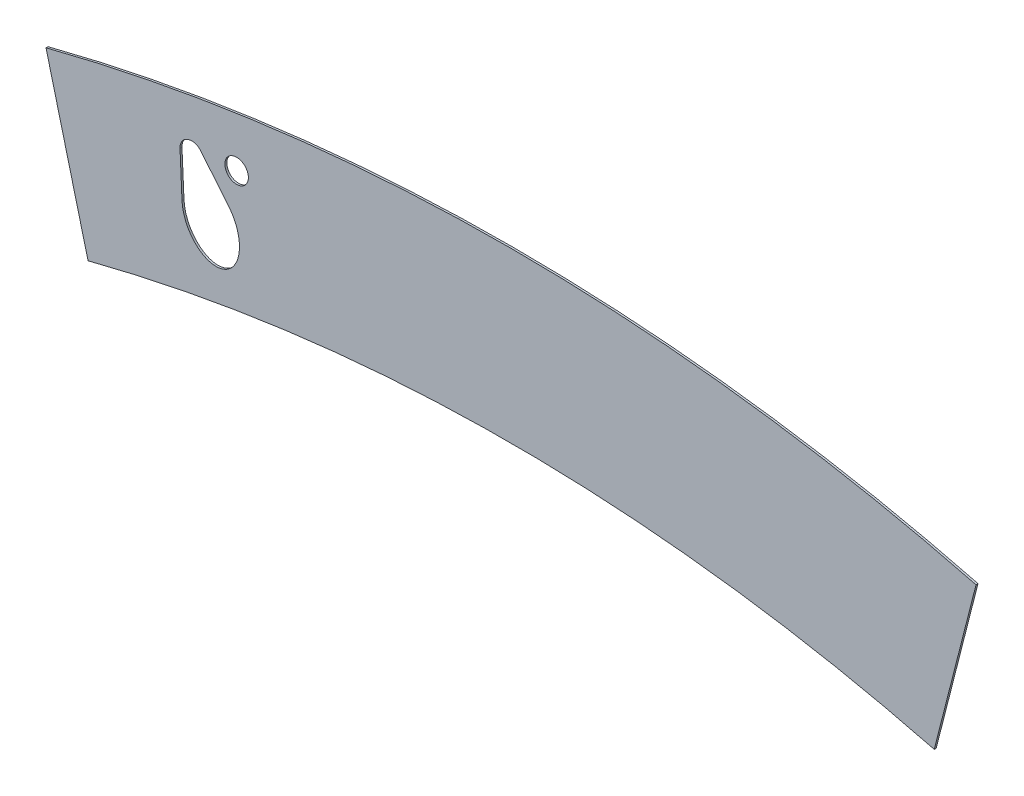
ISO-10303-21;
HEADER;
FILE_DESCRIPTION(('STEP AP214'),'2;1');
FILE_NAME('part.step','',(''),(''),'','','');
FILE_SCHEMA(('AUTOMOTIVE_DESIGN { 1 0 10303 214 1 1 1 1 }'));
ENDSEC;
DATA;
#1=APPLICATION_CONTEXT('core data for automotive mechanical design processes');
#2=APPLICATION_PROTOCOL_DEFINITION('international standard','automotive_design',2000,#1);
#3=PRODUCT_CONTEXT('',#1,'mechanical');
#4=PRODUCT('Part','Part','',(#3));
#5=PRODUCT_RELATED_PRODUCT_CATEGORY('part','',(#4));
#6=PRODUCT_DEFINITION_FORMATION('','',#4);
#7=PRODUCT_DEFINITION_CONTEXT('part definition',#1,'design');
#8=PRODUCT_DEFINITION('design','',#6,#7);
#9=PRODUCT_DEFINITION_SHAPE('','',#8);
#10=(LENGTH_UNIT() NAMED_UNIT(*) SI_UNIT(.MILLI.,.METRE.));
#11=(NAMED_UNIT(*) PLANE_ANGLE_UNIT() SI_UNIT($,.RADIAN.));
#12=(NAMED_UNIT(*) SI_UNIT($,.STERADIAN.) SOLID_ANGLE_UNIT());
#13=UNCERTAINTY_MEASURE_WITH_UNIT(LENGTH_MEASURE(1.E-05),#10,'distance_accuracy_value','');
#14=(GEOMETRIC_REPRESENTATION_CONTEXT(3) GLOBAL_UNCERTAINTY_ASSIGNED_CONTEXT((#13)) GLOBAL_UNIT_ASSIGNED_CONTEXT((#10,
#11,#12)) REPRESENTATION_CONTEXT('',''));
#15=CARTESIAN_POINT('',(0.,0.,0.));
#16=DIRECTION('',(0.,0.,1.));
#17=DIRECTION('',(1.,0.,0.));
#18=AXIS2_PLACEMENT_3D('',#15,#16,#17);
#19=CARTESIAN_POINT('',(-1.22124532708767E-12,-3019.5266,-3.175));
#20=DIRECTION('',(0.,0.,1.));
#21=DIRECTION('',(1.,0.,0.));
#22=AXIS2_PLACEMENT_3D('',#19,#20,#21);
#23=CYLINDRICAL_SURFACE('',#22,3019.5266);
#24=CARTESIAN_POINT('',(-9.43689570931383E-13,-3019.5266,0.));
#25=DIRECTION('',(0.,0.,1.));
#26=DIRECTION('',(1.,0.,0.));
#27=AXIS2_PLACEMENT_3D('',#24,#25,#26);
#28=CIRCLE('',#27,3019.5266);
#29=CARTESIAN_POINT('',(752.475,-95.2622031845274,0.));
#30=VERTEX_POINT('',#29);
#31=CARTESIAN_POINT('',(-752.475000000001,-95.2622031845269,0.));
#32=VERTEX_POINT('',#31);
#33=EDGE_CURVE('E170',#30,#32,#28,.T.);
#34=ORIENTED_EDGE('',*,*,#33,.F.);
#35=DIRECTION('',(0.,0.,1.));
#36=VECTOR('',#35,1.);
#37=CARTESIAN_POINT('',(752.475,-95.2622031845269,-3.175));
#38=LINE('',#37,#36);
#39=CARTESIAN_POINT('',(752.475,-95.2622031845269,-3.175));
#40=VERTEX_POINT('',#39);
#41=EDGE_CURVE('E11',#40,#30,#38,.T.);
#42=ORIENTED_EDGE('',*,*,#41,.F.);
#43=CARTESIAN_POINT('',(-1.22124532708767E-12,-3019.5266,-3.175));
#44=DIRECTION('',(0.,0.,1.));
#45=DIRECTION('',(1.,0.,0.));
#46=AXIS2_PLACEMENT_3D('',#43,#44,#45);
#47=CIRCLE('',#46,3019.5266);
#48=CARTESIAN_POINT('',(-752.475000000002,-95.2622031845296,-3.175));
#49=VERTEX_POINT('',#48);
#50=EDGE_CURVE('E184',#40,#49,#47,.T.);
#51=ORIENTED_EDGE('',*,*,#50,.T.);
#52=DIRECTION('',(0.,0.,1.));
#53=VECTOR('',#52,1.);
#54=CARTESIAN_POINT('',(-752.475000000002,-95.2622031845296,-3.175));
#55=LINE('',#54,#53);
#56=EDGE_CURVE('E37',#49,#32,#55,.T.);
#57=ORIENTED_EDGE('',*,*,#56,.T.);
#58=EDGE_LOOP('',(#34,#42,#51,#57));
#59=FACE_BOUND('',#58,.T.);
#60=ADVANCED_FACE('F34',(#59),#23,.T.);
#61=CARTESIAN_POINT('',(752.475,-95.2622031845269,-3.175));
#62=DIRECTION('',(0.968807712269234,-0.247813673245961,0.));
#63=DIRECTION('',(0.247813673245961,0.968807712269234,0.));
#64=AXIS2_PLACEMENT_3D('',#61,#62,#63);
#65=PLANE('',#64);
#66=DIRECTION('',(0.247813673245961,0.968807712269234,0.));
#67=VECTOR('',#66,1.);
#68=CARTESIAN_POINT('',(752.475,-95.2622031845274,0.));
#69=LINE('',#68,#67);
#70=CARTESIAN_POINT('',(684.8094,-359.795448169199,0.));
#71=VERTEX_POINT('',#70);
#72=EDGE_CURVE('E181',#71,#30,#69,.T.);
#73=ORIENTED_EDGE('',*,*,#72,.F.);
#74=DIRECTION('',(0.,0.,1.));
#75=VECTOR('',#74,1.);
#76=CARTESIAN_POINT('',(684.8094,-359.795448169201,-3.175));
#77=LINE('',#76,#75);
#78=CARTESIAN_POINT('',(684.8094,-359.795448169201,-3.175));
#79=VERTEX_POINT('',#78);
#80=EDGE_CURVE('E42',#79,#71,#77,.T.);
#81=ORIENTED_EDGE('',*,*,#80,.F.);
#82=DIRECTION('',(0.247813673245961,0.968807712269234,0.));
#83=VECTOR('',#82,1.);
#84=CARTESIAN_POINT('',(752.475,-95.2622031845269,-3.175));
#85=LINE('',#84,#83);
#86=EDGE_CURVE('E196',#79,#40,#85,.T.);
#87=ORIENTED_EDGE('',*,*,#86,.T.);
#88=ORIENTED_EDGE('',*,*,#41,.T.);
#89=EDGE_LOOP('',(#73,#81,#87,#88));
#90=FACE_BOUND('',#89,.T.);
#91=ADVANCED_FACE('F152',(#90),#65,.T.);
#92=CARTESIAN_POINT('',(-1.22124532708767E-12,-3019.5266,-3.175));
#93=DIRECTION('',(0.,0.,1.));
#94=DIRECTION('',(1.,0.,0.));
#95=AXIS2_PLACEMENT_3D('',#92,#93,#94);
#96=CYLINDRICAL_SURFACE('',#95,2746.4766);
#97=CARTESIAN_POINT('',(-9.43689570931383E-13,-3019.5266,0.));
#98=DIRECTION('',(0.,0.,-1.));
#99=DIRECTION('',(1.,0.,0.));
#100=AXIS2_PLACEMENT_3D('',#97,#98,#99);
#101=CIRCLE('',#100,2746.4766);
#102=CARTESIAN_POINT('',(-684.4284,-359.697379989626,0.));
#103=VERTEX_POINT('',#102);
#104=EDGE_CURVE('E183',#103,#71,#101,.T.);
#105=ORIENTED_EDGE('',*,*,#104,.F.);
#106=DIRECTION('',(0.,0.,1.));
#107=VECTOR('',#106,1.);
#108=CARTESIAN_POINT('',(-684.428400000001,-359.697379989625,-3.175));
#109=LINE('',#108,#107);
#110=CARTESIAN_POINT('',(-684.428400000001,-359.697379989625,-3.175));
#111=VERTEX_POINT('',#110);
#112=EDGE_CURVE('E199',#111,#103,#109,.T.);
#113=ORIENTED_EDGE('',*,*,#112,.F.);
#114=CARTESIAN_POINT('',(-1.22124532708767E-12,-3019.5266,-3.175));
#115=DIRECTION('',(0.,0.,-1.));
#116=DIRECTION('',(1.,0.,0.));
#117=AXIS2_PLACEMENT_3D('',#114,#115,#116);
#118=CIRCLE('',#117,2746.4766);
#119=EDGE_CURVE('E193',#111,#79,#118,.T.);
#120=ORIENTED_EDGE('',*,*,#119,.T.);
#121=ORIENTED_EDGE('',*,*,#80,.T.);
#122=EDGE_LOOP('',(#105,#113,#120,#121));
#123=FACE_BOUND('',#122,.T.);
#124=ADVANCED_FACE('F155',(#123),#96,.F.);
#125=CARTESIAN_POINT('',(-752.475000000002,-95.2622031845296,-3.175));
#126=DIRECTION('',(-0.968449649510659,-0.249209302319726,0.));
#127=DIRECTION('',(0.249209302319726,-0.968449649510659,0.));
#128=AXIS2_PLACEMENT_3D('',#125,#126,#127);
#129=PLANE('',#128);
#130=DIRECTION('',(0.249209302319726,-0.968449649510658,0.));
#131=VECTOR('',#130,1.);
#132=CARTESIAN_POINT('',(-752.475000000001,-95.2622031845269,0.));
#133=LINE('',#132,#131);
#134=EDGE_CURVE('E176',#32,#103,#133,.T.);
#135=ORIENTED_EDGE('',*,*,#134,.F.);
#136=ORIENTED_EDGE('',*,*,#56,.F.);
#137=DIRECTION('',(0.249209302319726,-0.968449649510658,0.));
#138=VECTOR('',#137,1.);
#139=CARTESIAN_POINT('',(-752.475000000002,-95.2622031845296,-3.175));
#140=LINE('',#139,#138);
#141=EDGE_CURVE('E186',#49,#111,#140,.T.);
#142=ORIENTED_EDGE('',*,*,#141,.T.);
#143=ORIENTED_EDGE('',*,*,#112,.T.);
#144=EDGE_LOOP('',(#135,#136,#142,#143));
#145=FACE_BOUND('',#144,.T.);
#146=ADVANCED_FACE('F150',(#145),#129,.T.);
#147=CARTESIAN_POINT('',(-1.22124532708767E-12,-3019.5266,-3.175));
#148=DIRECTION('',(0.,0.,1.));
#149=DIRECTION('',(1.,0.,0.));
#150=AXIS2_PLACEMENT_3D('',#147,#148,#149);
#151=PLANE('',#150);
#152=DIRECTION('',(-0.633664459437603,0.773608009812239,0.));
#153=VECTOR('',#152,1.);
#154=CARTESIAN_POINT('',(-501.846758134813,-114.814876018588,-3.175));
#155=LINE('',#154,#153);
#156=CARTESIAN_POINT('',(-456.359855013674,-170.347472287755,-3.175));
#157=VERTEX_POINT('',#156);
#158=CARTESIAN_POINT('',(-501.846758134813,-114.814876018588,-3.175));
#159=VERTEX_POINT('',#158);
#160=EDGE_CURVE('E129',#157,#159,#155,.T.);
#161=ORIENTED_EDGE('',*,*,#160,.T.);
#162=CARTESIAN_POINT('',(-516.583990721737,-126.886183970876,-3.175));
#163=DIRECTION('',(0.,0.,1.));
#164=DIRECTION('',(1.,0.,0.));
#165=AXIS2_PLACEMENT_3D('',#162,#163,#164);
#166=CIRCLE('',#165,19.0500000000005);
#167=CARTESIAN_POINT('',(-535.614695533332,-127.743373782972,-3.175));
#168=VERTEX_POINT('',#167);
#169=EDGE_CURVE('E119',#159,#168,#166,.T.);
#170=ORIENTED_EDGE('',*,*,#169,.T.);
#171=DIRECTION('',(0.0449968405300511,-0.998987129217546,0.));
#172=VECTOR('',#171,1.);
#173=CARTESIAN_POINT('',(-535.614695533332,-127.743373782972,-3.175));
#174=LINE('',#173,#172);
#175=CARTESIAN_POINT('',(-532.384647050315,-199.454561130161,-3.175));
#176=VERTEX_POINT('',#175);
#177=EDGE_CURVE('E125',#168,#176,#174,.T.);
#178=ORIENTED_EDGE('',*,*,#177,.T.);
#179=CARTESIAN_POINT('',(-485.932750317386,-206.944144766006,-3.175));
#180=DIRECTION('',(0.,0.,1.));
#181=DIRECTION('',(-0.357553110578587,0.933892806009115,0.));
#182=AXIS2_PLACEMENT_3D('',#179,#180,#181);
#183=ELLIPSE('',#182,58.7375,44.4499999999999);
#184=EDGE_CURVE('E50',#176,#157,#183,.T.);
#185=ORIENTED_EDGE('',*,*,#184,.T.);
#186=EDGE_LOOP('',(#161,#170,#178,#185));
#187=FACE_BOUND('',#186,.T.);
#188=CARTESIAN_POINT('',(-444.017400000001,-113.461800000002,-3.175));
#189=DIRECTION('',(0.,0.,1.));
#190=DIRECTION('',(1.,0.,0.));
#191=AXIS2_PLACEMENT_3D('',#188,#189,#190);
#192=CIRCLE('',#191,19.05);
#193=CARTESIAN_POINT('',(-424.967400000001,-113.461800000002,-3.175));
#194=VERTEX_POINT('',#193);
#195=EDGE_CURVE('E177',#194,#194,#192,.T.);
#196=ORIENTED_EDGE('',*,*,#195,.T.);
#197=EDGE_LOOP('',(#196));
#198=FACE_BOUND('',#197,.T.);
#199=ORIENTED_EDGE('',*,*,#50,.F.);
#200=ORIENTED_EDGE('',*,*,#86,.F.);
#201=ORIENTED_EDGE('',*,*,#119,.F.);
#202=ORIENTED_EDGE('',*,*,#141,.F.);
#203=EDGE_LOOP('',(#199,#200,#201,#202));
#204=FACE_BOUND('',#203,.T.);
#205=ADVANCED_FACE('F147',(#187,#198,#204),#151,.F.);
#206=CARTESIAN_POINT('',(-9.43689570931383E-13,-3019.5266,0.));
#207=DIRECTION('',(0.,0.,1.));
#208=DIRECTION('',(1.,0.,0.));
#209=AXIS2_PLACEMENT_3D('',#206,#207,#208);
#210=PLANE('',#209);
#211=CARTESIAN_POINT('',(-516.583990721736,-126.886183970874,0.));
#212=DIRECTION('',(0.,0.,1.));
#213=DIRECTION('',(1.,0.,0.));
#214=AXIS2_PLACEMENT_3D('',#211,#212,#213);
#215=CIRCLE('',#214,19.0500000000005);
#216=CARTESIAN_POINT('',(-501.846758134812,-114.814876018588,0.));
#217=VERTEX_POINT('',#216);
#218=CARTESIAN_POINT('',(-535.614695533332,-127.743373782972,0.));
#219=VERTEX_POINT('',#218);
#220=EDGE_CURVE('E58',#217,#219,#215,.T.);
#221=ORIENTED_EDGE('',*,*,#220,.F.);
#222=DIRECTION('',(-0.633664459437603,0.773608009812239,0.));
#223=VECTOR('',#222,1.);
#224=CARTESIAN_POINT('',(-501.846758134812,-114.814876018588,0.));
#225=LINE('',#224,#223);
#226=CARTESIAN_POINT('',(-456.359855013673,-170.347472287756,0.));
#227=VERTEX_POINT('',#226);
#228=EDGE_CURVE('E117',#227,#217,#225,.T.);
#229=ORIENTED_EDGE('',*,*,#228,.F.);
#230=CARTESIAN_POINT('',(-485.932750317388,-206.944144766007,0.));
#231=DIRECTION('',(0.,0.,1.));
#232=DIRECTION('',(-0.357553110578587,0.933892806009115,0.));
#233=AXIS2_PLACEMENT_3D('',#230,#231,#232);
#234=ELLIPSE('',#233,58.7375,44.4499999999999);
#235=CARTESIAN_POINT('',(-532.384647050315,-199.454561130163,0.));
#236=VERTEX_POINT('',#235);
#237=EDGE_CURVE('E101',#236,#227,#234,.T.);
#238=ORIENTED_EDGE('',*,*,#237,.F.);
#239=DIRECTION('',(0.0449968405300511,-0.998987129217546,0.));
#240=VECTOR('',#239,1.);
#241=CARTESIAN_POINT('',(-535.614695533332,-127.743373782972,0.));
#242=LINE('',#241,#240);
#243=EDGE_CURVE('E110',#219,#236,#242,.T.);
#244=ORIENTED_EDGE('',*,*,#243,.F.);
#245=EDGE_LOOP('',(#221,#229,#238,#244));
#246=FACE_BOUND('',#245,.T.);
#247=CARTESIAN_POINT('',(-444.0174,-113.461800000001,0.));
#248=DIRECTION('',(0.,0.,1.));
#249=DIRECTION('',(1.,0.,0.));
#250=AXIS2_PLACEMENT_3D('',#247,#248,#249);
#251=CIRCLE('',#250,19.05);
#252=CARTESIAN_POINT('',(-424.9674,-113.461800000001,0.));
#253=VERTEX_POINT('',#252);
#254=EDGE_CURVE('E205',#253,#253,#251,.T.);
#255=ORIENTED_EDGE('',*,*,#254,.F.);
#256=EDGE_LOOP('',(#255));
#257=FACE_BOUND('',#256,.T.);
#258=ORIENTED_EDGE('',*,*,#33,.T.);
#259=ORIENTED_EDGE('',*,*,#134,.T.);
#260=ORIENTED_EDGE('',*,*,#104,.T.);
#261=ORIENTED_EDGE('',*,*,#72,.T.);
#262=EDGE_LOOP('',(#258,#259,#260,#261));
#263=FACE_BOUND('',#262,.T.);
#264=ADVANCED_FACE('F114',(#246,#257,#263),#210,.T.);
#265=CARTESIAN_POINT('',(-444.017400000001,-113.461800000002,-3.175));
#266=DIRECTION('',(0.,0.,1.));
#267=DIRECTION('',(1.,0.,0.));
#268=AXIS2_PLACEMENT_3D('',#265,#266,#267);
#269=CYLINDRICAL_SURFACE('',#268,19.05);
#270=ORIENTED_EDGE('',*,*,#195,.F.);
#271=EDGE_LOOP('',(#270));
#272=FACE_BOUND('',#271,.T.);
#273=ORIENTED_EDGE('',*,*,#254,.T.);
#274=EDGE_LOOP('',(#273));
#275=FACE_BOUND('',#274,.T.);
#276=ADVANCED_FACE('F141',(#272,#275),#269,.F.);
#277=CARTESIAN_POINT('',(-516.583990721737,-126.886183970876,-3.175));
#278=DIRECTION('',(0.,0.,1.));
#279=DIRECTION('',(1.,0.,0.));
#280=AXIS2_PLACEMENT_3D('',#277,#278,#279);
#281=CYLINDRICAL_SURFACE('',#280,19.0500000000005);
#282=ORIENTED_EDGE('',*,*,#220,.T.);
#283=DIRECTION('',(0.,0.,1.));
#284=VECTOR('',#283,1.);
#285=CARTESIAN_POINT('',(-535.614695533332,-127.743373782972,-3.175));
#286=LINE('',#285,#284);
#287=EDGE_CURVE('E107',#168,#219,#286,.T.);
#288=ORIENTED_EDGE('',*,*,#287,.F.);
#289=ORIENTED_EDGE('',*,*,#169,.F.);
#290=DIRECTION('',(0.,0.,1.));
#291=VECTOR('',#290,1.);
#292=CARTESIAN_POINT('',(-501.846758134813,-114.814876018588,-3.175));
#293=LINE('',#292,#291);
#294=EDGE_CURVE('E208',#159,#217,#293,.T.);
#295=ORIENTED_EDGE('',*,*,#294,.T.);
#296=EDGE_LOOP('',(#282,#288,#289,#295));
#297=FACE_BOUND('',#296,.T.);
#298=ADVANCED_FACE('F138',(#297),#281,.F.);
#299=CARTESIAN_POINT('',(-501.846758134813,-114.814876018588,-3.175));
#300=DIRECTION('',(0.773608009812238,0.633664459437602,0.));
#301=DIRECTION('',(-0.633664459437603,0.773608009812239,0.));
#302=AXIS2_PLACEMENT_3D('',#299,#300,#301);
#303=PLANE('',#302);
#304=ORIENTED_EDGE('',*,*,#228,.T.);
#305=ORIENTED_EDGE('',*,*,#294,.F.);
#306=ORIENTED_EDGE('',*,*,#160,.F.);
#307=DIRECTION('',(0.,0.,1.));
#308=VECTOR('',#307,1.);
#309=CARTESIAN_POINT('',(-456.359855013674,-170.347472287755,-3.175));
#310=LINE('',#309,#308);
#311=EDGE_CURVE('E106',#157,#227,#310,.T.);
#312=ORIENTED_EDGE('',*,*,#311,.T.);
#313=EDGE_LOOP('',(#304,#305,#306,#312));
#314=FACE_BOUND('',#313,.T.);
#315=ADVANCED_FACE('F135',(#314),#303,.F.);
#316=DIRECTION('',(0.,0.,1.));
#317=VECTOR('',#316,1.);
#318=SURFACE_OF_LINEAR_EXTRUSION('',#183,#317);
#319=ORIENTED_EDGE('',*,*,#237,.T.);
#320=ORIENTED_EDGE('',*,*,#311,.F.);
#321=ORIENTED_EDGE('',*,*,#184,.F.);
#322=DIRECTION('',(0.,0.,1.));
#323=VECTOR('',#322,1.);
#324=CARTESIAN_POINT('',(-532.384647050315,-199.454561130161,-3.175));
#325=LINE('',#324,#323);
#326=EDGE_CURVE('E97',#176,#236,#325,.T.);
#327=ORIENTED_EDGE('',*,*,#326,.T.);
#328=EDGE_LOOP('',(#319,#320,#321,#327));
#329=FACE_BOUND('',#328,.T.);
#330=ADVANCED_FACE('F99',(#329),#318,.F.);
#331=CARTESIAN_POINT('',(-535.614695533332,-127.743373782972,-3.175));
#332=DIRECTION('',(-0.998987129217546,-0.0449968405300515,0.));
#333=DIRECTION('',(0.0449968405300511,-0.998987129217546,0.));
#334=AXIS2_PLACEMENT_3D('',#331,#332,#333);
#335=PLANE('',#334);
#336=ORIENTED_EDGE('',*,*,#243,.T.);
#337=ORIENTED_EDGE('',*,*,#326,.F.);
#338=ORIENTED_EDGE('',*,*,#177,.F.);
#339=ORIENTED_EDGE('',*,*,#287,.T.);
#340=EDGE_LOOP('',(#336,#337,#338,#339));
#341=FACE_BOUND('',#340,.T.);
#342=ADVANCED_FACE('F111',(#341),#335,.F.);
#343=CLOSED_SHELL('',(#60,#91,#124,#146,#205,#264,#276,#298,#315,#330,#342));
#344=MANIFOLD_SOLID_BREP('B2',#343);
#345=ADVANCED_BREP_SHAPE_REPRESENTATION('',(#18,#344),#14);
#346=SHAPE_DEFINITION_REPRESENTATION(#9,#345);
ENDSEC;
END-ISO-10303-21;
